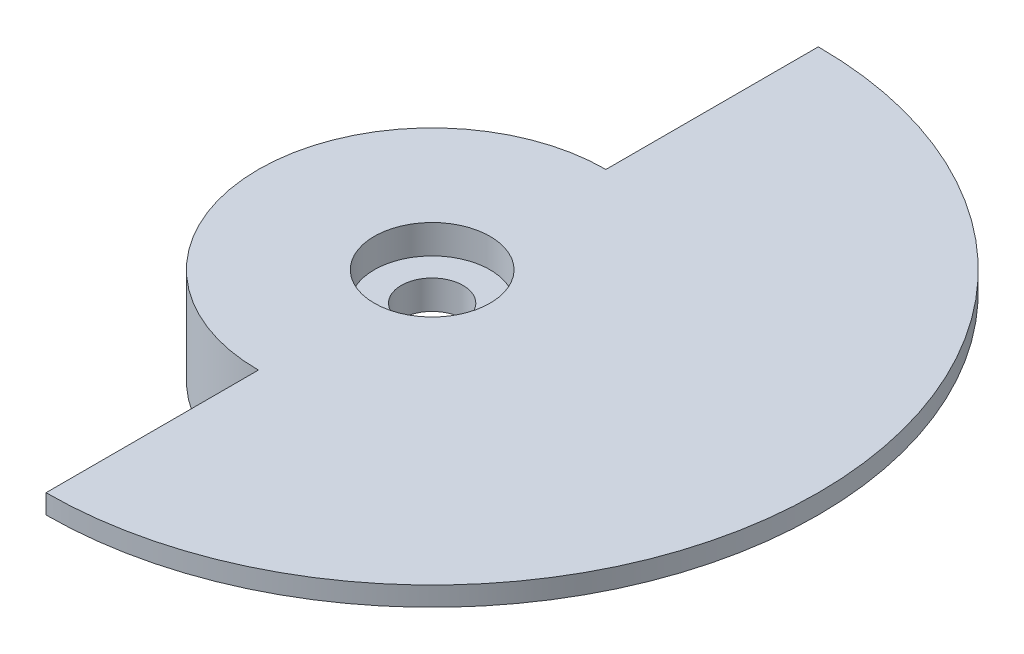
ISO-10303-21;
HEADER;
FILE_DESCRIPTION(('STEP AP214'),'2;1');
FILE_NAME('part.step','',(''),(''),'','','');
FILE_SCHEMA(('AUTOMOTIVE_DESIGN { 1 0 10303 214 1 1 1 1 }'));
ENDSEC;
DATA;
#1=APPLICATION_CONTEXT('core data for automotive mechanical design processes');
#2=APPLICATION_PROTOCOL_DEFINITION('international standard','automotive_design',2000,#1);
#3=PRODUCT_CONTEXT('',#1,'mechanical');
#4=PRODUCT('Part','Part','',(#3));
#5=PRODUCT_RELATED_PRODUCT_CATEGORY('part','',(#4));
#6=PRODUCT_DEFINITION_FORMATION('','',#4);
#7=PRODUCT_DEFINITION_CONTEXT('part definition',#1,'design');
#8=PRODUCT_DEFINITION('design','',#6,#7);
#9=PRODUCT_DEFINITION_SHAPE('','',#8);
#10=(LENGTH_UNIT() NAMED_UNIT(*) SI_UNIT(.MILLI.,.METRE.));
#11=(NAMED_UNIT(*) PLANE_ANGLE_UNIT() SI_UNIT($,.RADIAN.));
#12=(NAMED_UNIT(*) SI_UNIT($,.STERADIAN.) SOLID_ANGLE_UNIT());
#13=UNCERTAINTY_MEASURE_WITH_UNIT(LENGTH_MEASURE(1.E-05),#10,'distance_accuracy_value','');
#14=(GEOMETRIC_REPRESENTATION_CONTEXT(3) GLOBAL_UNCERTAINTY_ASSIGNED_CONTEXT((#13)) GLOBAL_UNIT_ASSIGNED_CONTEXT((#10,
#11,#12)) REPRESENTATION_CONTEXT('',''));
#15=CARTESIAN_POINT('',(0.,0.,0.));
#16=DIRECTION('',(0.,0.,1.));
#17=DIRECTION('',(1.,0.,0.));
#18=AXIS2_PLACEMENT_3D('',#15,#16,#17);
#19=CARTESIAN_POINT('',(0.,3.,0.));
#20=DIRECTION('',(0.,1.,0.));
#21=DIRECTION('',(0.,0.,1.));
#22=AXIS2_PLACEMENT_3D('',#19,#20,#21);
#23=CYLINDRICAL_SURFACE('',#22,1.6);
#24=CARTESIAN_POINT('',(0.,3.,0.));
#25=DIRECTION('',(0.,1.,0.));
#26=DIRECTION('',(0.,0.,1.));
#27=AXIS2_PLACEMENT_3D('',#24,#25,#26);
#28=CIRCLE('',#27,1.6);
#29=CARTESIAN_POINT('',(0.,3.,1.6));
#30=VERTEX_POINT('',#29);
#31=EDGE_CURVE('E255',#30,#30,#28,.T.);
#32=ORIENTED_EDGE('',*,*,#31,.F.);
#33=EDGE_LOOP('',(#32));
#34=FACE_BOUND('',#33,.T.);
#35=CARTESIAN_POINT('',(0.,4.5,0.));
#36=DIRECTION('',(0.,1.,0.));
#37=DIRECTION('',(0.,0.,1.));
#38=AXIS2_PLACEMENT_3D('',#35,#36,#37);
#39=CIRCLE('',#38,1.6);
#40=CARTESIAN_POINT('',(0.,4.5,1.6));
#41=VERTEX_POINT('',#40);
#42=EDGE_CURVE('E253',#41,#41,#39,.F.);
#43=ORIENTED_EDGE('',*,*,#42,.F.);
#44=EDGE_LOOP('',(#43));
#45=FACE_BOUND('',#44,.T.);
#46=ADVANCED_FACE('F43',(#34,#45),#23,.F.);
#47=CARTESIAN_POINT('',(0.,6.,0.));
#48=DIRECTION('',(0.,-1.,0.));
#49=DIRECTION('',(0.,0.,-1.));
#50=AXIS2_PLACEMENT_3D('',#47,#48,#49);
#51=CYLINDRICAL_SURFACE('',#50,7.5);
#52=DIRECTION('',(0.,-1.,0.));
#53=VECTOR('',#52,1.);
#54=CARTESIAN_POINT('',(0.856553191197171,3.,7.45092723294566));
#55=LINE('',#54,#53);
#56=CARTESIAN_POINT('',(0.85655319119717,3.,7.45092723294557));
#57=VERTEX_POINT('',#56);
#58=CARTESIAN_POINT('',(0.856553191197171,0.,7.45092723294557));
#59=VERTEX_POINT('',#58);
#60=EDGE_CURVE('E198',#57,#59,#55,.T.);
#61=ORIENTED_EDGE('',*,*,#60,.F.);
#62=CARTESIAN_POINT('',(0.,3.,0.));
#63=DIRECTION('',(0.,1.,0.));
#64=DIRECTION('',(0.,0.,1.));
#65=AXIS2_PLACEMENT_3D('',#62,#63,#64);
#66=CIRCLE('',#65,7.5);
#67=CARTESIAN_POINT('',(7.44042990767577,3.,0.943399591352425));
#68=VERTEX_POINT('',#67);
#69=EDGE_CURVE('E180',#57,#68,#66,.T.);
#70=ORIENTED_EDGE('',*,*,#69,.T.);
#71=DIRECTION('',(0.,-1.,0.));
#72=VECTOR('',#71,1.);
#73=CARTESIAN_POINT('',(7.44042990767586,3.,0.943399591352425));
#74=LINE('',#73,#72);
#75=CARTESIAN_POINT('',(7.44042990767586,0.,0.943399591352425));
#76=VERTEX_POINT('',#75);
#77=EDGE_CURVE('E584',#68,#76,#74,.T.);
#78=ORIENTED_EDGE('',*,*,#77,.T.);
#79=CARTESIAN_POINT('',(0.,0.,0.));
#80=DIRECTION('',(0.,1.,0.));
#81=DIRECTION('',(0.,0.,1.));
#82=AXIS2_PLACEMENT_3D('',#79,#80,#81);
#83=CIRCLE('',#82,7.5);
#84=EDGE_CURVE('E208',#59,#76,#83,.T.);
#85=ORIENTED_EDGE('',*,*,#84,.F.);
#86=EDGE_LOOP('',(#61,#70,#78,#85));
#87=FACE_BOUND('',#86,.T.);
#88=ADVANCED_FACE('F206',(#87),#51,.F.);
#89=DIRECTION('',(0.,-1.,0.));
#90=VECTOR('',#89,1.);
#91=CARTESIAN_POINT('',(7.45092723294566,3.,-0.85655319119717));
#92=LINE('',#91,#90);
#93=CARTESIAN_POINT('',(7.45092723294557,3.,-0.85655319119717));
#94=VERTEX_POINT('',#93);
#95=CARTESIAN_POINT('',(7.45092723294557,0.,-0.85655319119717));
#96=VERTEX_POINT('',#95);
#97=EDGE_CURVE('E578',#94,#96,#92,.T.);
#98=ORIENTED_EDGE('',*,*,#97,.F.);
#99=CARTESIAN_POINT('',(0.943399591352426,3.,-7.44042990767577));
#100=VERTEX_POINT('',#99);
#101=EDGE_CURVE('E192',#94,#100,#66,.T.);
#102=ORIENTED_EDGE('',*,*,#101,.T.);
#103=DIRECTION('',(0.,-1.,0.));
#104=VECTOR('',#103,1.);
#105=CARTESIAN_POINT('',(0.943399591352429,3.,-7.44042990767586));
#106=LINE('',#105,#104);
#107=CARTESIAN_POINT('',(0.943399591352429,0.,-7.44042990767586));
#108=VERTEX_POINT('',#107);
#109=EDGE_CURVE('E659',#100,#108,#106,.T.);
#110=ORIENTED_EDGE('',*,*,#109,.T.);
#111=EDGE_CURVE('E250',#96,#108,#83,.T.);
#112=ORIENTED_EDGE('',*,*,#111,.F.);
#113=EDGE_LOOP('',(#98,#102,#110,#112));
#114=FACE_BOUND('',#113,.T.);
#115=ADVANCED_FACE('F282',(#114),#51,.F.);
#116=DIRECTION('',(0.,-1.,0.));
#117=VECTOR('',#116,1.);
#118=CARTESIAN_POINT('',(-0.85655319119717,3.,-7.45092723294566));
#119=LINE('',#118,#117);
#120=CARTESIAN_POINT('',(-0.856553191196794,3.,-7.45092723294561));
#121=VERTEX_POINT('',#120);
#122=CARTESIAN_POINT('',(-0.85655319119717,0.,-7.45092723294557));
#123=VERTEX_POINT('',#122);
#124=EDGE_CURVE('E656',#121,#123,#119,.T.);
#125=ORIENTED_EDGE('',*,*,#124,.F.);
#126=CARTESIAN_POINT('',(-7.44042990767577,3.,-0.943399591352426));
#127=VERTEX_POINT('',#126);
#128=EDGE_CURVE('E627',#121,#127,#66,.T.);
#129=ORIENTED_EDGE('',*,*,#128,.T.);
#130=DIRECTION('',(0.,-1.,0.));
#131=VECTOR('',#130,1.);
#132=CARTESIAN_POINT('',(-7.44042990767582,3.,-0.943399591352415));
#133=LINE('',#132,#131);
#134=CARTESIAN_POINT('',(-7.44042990767582,0.,-0.943399591352415));
#135=VERTEX_POINT('',#134);
#136=EDGE_CURVE('E635',#127,#135,#133,.T.);
#137=ORIENTED_EDGE('',*,*,#136,.T.);
#138=EDGE_CURVE('E680',#123,#135,#83,.T.);
#139=ORIENTED_EDGE('',*,*,#138,.F.);
#140=EDGE_LOOP('',(#125,#129,#137,#139));
#141=FACE_BOUND('',#140,.T.);
#142=ADVANCED_FACE('F477',(#141),#51,.F.);
#143=DIRECTION('',(0.,-1.,0.));
#144=VECTOR('',#143,1.);
#145=CARTESIAN_POINT('',(-7.45092723294559,3.,0.856553191197039));
#146=LINE('',#145,#144);
#147=CARTESIAN_POINT('',(-7.45092723294559,3.,0.856553191197039));
#148=VERTEX_POINT('',#147);
#149=CARTESIAN_POINT('',(-7.45092723294559,0.,0.856553191197038));
#150=VERTEX_POINT('',#149);
#151=EDGE_CURVE('E626',#148,#150,#146,.T.);
#152=ORIENTED_EDGE('',*,*,#151,.F.);
#153=CARTESIAN_POINT('',(-0.943399591352425,3.,7.44042990767577));
#154=VERTEX_POINT('',#153);
#155=EDGE_CURVE('E194',#148,#154,#66,.T.);
#156=ORIENTED_EDGE('',*,*,#155,.T.);
#157=DIRECTION('',(0.,-1.,0.));
#158=VECTOR('',#157,1.);
#159=CARTESIAN_POINT('',(-0.943399591352425,3.,7.44042990767586));
#160=LINE('',#159,#158);
#161=CARTESIAN_POINT('',(-0.943399591352425,0.,7.44042990767586));
#162=VERTEX_POINT('',#161);
#163=EDGE_CURVE('E209',#154,#162,#160,.T.);
#164=ORIENTED_EDGE('',*,*,#163,.T.);
#165=EDGE_CURVE('E241',#150,#162,#83,.T.);
#166=ORIENTED_EDGE('',*,*,#165,.F.);
#167=EDGE_LOOP('',(#152,#156,#164,#166));
#168=FACE_BOUND('',#167,.T.);
#169=ADVANCED_FACE('F284',(#168),#51,.F.);
#170=CARTESIAN_POINT('',(0.,6.,0.));
#171=DIRECTION('',(0.,1.,0.));
#172=DIRECTION('',(0.,0.,1.));
#173=AXIS2_PLACEMENT_3D('',#170,#171,#172);
#174=PLANE('',#173);
#175=CARTESIAN_POINT('',(0.,6.,0.));
#176=DIRECTION('',(0.,1.,0.));
#177=DIRECTION('',(0.,0.,1.));
#178=AXIS2_PLACEMENT_3D('',#175,#176,#177);
#179=CIRCLE('',#178,3.);
#180=CARTESIAN_POINT('',(0.,6.,3.));
#181=VERTEX_POINT('',#180);
#182=EDGE_CURVE('E688',#181,#181,#179,.T.);
#183=ORIENTED_EDGE('',*,*,#182,.F.);
#184=EDGE_LOOP('',(#183));
#185=FACE_BOUND('',#184,.T.);
#186=CARTESIAN_POINT('',(0.,6.,0.));
#187=DIRECTION('',(0.,1.,0.));
#188=DIRECTION('',(0.,0.,1.));
#189=AXIS2_PLACEMENT_3D('',#186,#187,#188);
#190=CIRCLE('',#189,9.);
#191=CARTESIAN_POINT('',(0.,6.,-9.));
#192=VERTEX_POINT('',#191);
#193=CARTESIAN_POINT('',(0.,6.,9.));
#194=VERTEX_POINT('',#193);
#195=EDGE_CURVE('E249',#192,#194,#190,.T.);
#196=ORIENTED_EDGE('',*,*,#195,.T.);
#197=DIRECTION('',(0.,0.,1.));
#198=VECTOR('',#197,1.);
#199=CARTESIAN_POINT('',(0.,6.,0.));
#200=LINE('',#199,#198);
#201=CARTESIAN_POINT('',(0.,6.,20.));
#202=VERTEX_POINT('',#201);
#203=EDGE_CURVE('E230',#194,#202,#200,.T.);
#204=ORIENTED_EDGE('',*,*,#203,.T.);
#205=CARTESIAN_POINT('',(0.,6.,0.));
#206=DIRECTION('',(0.,1.,0.));
#207=DIRECTION('',(0.,0.,1.));
#208=AXIS2_PLACEMENT_3D('',#205,#206,#207);
#209=CIRCLE('',#208,20.);
#210=CARTESIAN_POINT('',(0.,6.,-20.));
#211=VERTEX_POINT('',#210);
#212=EDGE_CURVE('E233',#202,#211,#209,.T.);
#213=ORIENTED_EDGE('',*,*,#212,.T.);
#214=DIRECTION('',(0.,0.,-1.));
#215=VECTOR('',#214,1.);
#216=CARTESIAN_POINT('',(0.,6.,0.));
#217=LINE('',#216,#215);
#218=EDGE_CURVE('E222',#192,#211,#217,.T.);
#219=ORIENTED_EDGE('',*,*,#218,.F.);
#220=EDGE_LOOP('',(#196,#204,#213,#219));
#221=FACE_BOUND('',#220,.T.);
#222=ADVANCED_FACE('F353',(#185,#221),#174,.T.);
#223=CARTESIAN_POINT('',(0.,0.,0.));
#224=DIRECTION('',(0.,1.,0.));
#225=DIRECTION('',(0.,0.,1.));
#226=AXIS2_PLACEMENT_3D('',#223,#224,#225);
#227=PLANE('',#226);
#228=CARTESIAN_POINT('',(0.,0.,0.));
#229=DIRECTION('',(0.,1.,0.));
#230=DIRECTION('',(0.,0.,1.));
#231=AXIS2_PLACEMENT_3D('',#228,#229,#230);
#232=CIRCLE('',#231,7.99999999999999);
#233=CARTESIAN_POINT('',(0.,0.,7.99999999999999));
#234=VERTEX_POINT('',#233);
#235=EDGE_CURVE('E11',#234,#234,#232,.F.);
#236=ORIENTED_EDGE('',*,*,#235,.T.);
#237=EDGE_LOOP('',(#236));
#238=FACE_BOUND('',#237,.T.);
#239=ORIENTED_EDGE('',*,*,#84,.T.);
#240=DIRECTION('',(-1.,0.,0.));
#241=VECTOR('',#240,1.);
#242=CARTESIAN_POINT('',(6.3123397412791,0.,0.943399591352425));
#243=LINE('',#242,#241);
#244=CARTESIAN_POINT('',(5.41848661630136,0.,0.943399591352425));
#245=VERTEX_POINT('',#244);
#246=EDGE_CURVE('E601',#76,#245,#243,.T.);
#247=ORIENTED_EDGE('',*,*,#246,.T.);
#248=CARTESIAN_POINT('',(0.,0.,0.));
#249=DIRECTION('',(0.,1.,0.));
#250=DIRECTION('',(0.,0.,-1.));
#251=AXIS2_PLACEMENT_3D('',#248,#249,#250);
#252=CIRCLE('',#251,5.50000000000008);
#253=CARTESIAN_POINT('',(5.43289210555951,0.,-0.85655319119717));
#254=VERTEX_POINT('',#253);
#255=EDGE_CURVE('E598',#245,#254,#252,.T.);
#256=ORIENTED_EDGE('',*,*,#255,.T.);
#257=DIRECTION('',(1.,0.,0.));
#258=VECTOR('',#257,1.);
#259=CARTESIAN_POINT('',(6.32608265113426,0.,-0.85655319119717));
#260=LINE('',#259,#258);
#261=EDGE_CURVE('E605',#254,#96,#260,.T.);
#262=ORIENTED_EDGE('',*,*,#261,.T.);
#263=ORIENTED_EDGE('',*,*,#111,.T.);
#264=DIRECTION('',(0.,0.,1.));
#265=VECTOR('',#264,1.);
#266=CARTESIAN_POINT('',(0.943399591352426,0.,-6.3123397412791));
#267=LINE('',#266,#265);
#268=CARTESIAN_POINT('',(0.943399591352426,0.,-5.41848661630136));
#269=VERTEX_POINT('',#268);
#270=EDGE_CURVE('E667',#108,#269,#267,.T.);
#271=ORIENTED_EDGE('',*,*,#270,.T.);
#272=CARTESIAN_POINT('',(0.,0.,0.));
#273=DIRECTION('',(0.,1.,0.));
#274=DIRECTION('',(0.,0.,-1.));
#275=AXIS2_PLACEMENT_3D('',#272,#273,#274);
#276=CIRCLE('',#275,5.50000000000008);
#277=CARTESIAN_POINT('',(-0.856553191197174,0.,-5.43289210555951));
#278=VERTEX_POINT('',#277);
#279=EDGE_CURVE('E665',#269,#278,#276,.T.);
#280=ORIENTED_EDGE('',*,*,#279,.T.);
#281=DIRECTION('',(-1.47471868623086E-13,0.,-1.));
#282=VECTOR('',#281,1.);
#283=CARTESIAN_POINT('',(-0.856553191197004,0.,-6.32608265113425));
#284=LINE('',#283,#282);
#285=EDGE_CURVE('E66',#278,#123,#284,.T.);
#286=ORIENTED_EDGE('',*,*,#285,.T.);
#287=ORIENTED_EDGE('',*,*,#138,.T.);
#288=DIRECTION('',(1.,0.,0.));
#289=VECTOR('',#288,1.);
#290=CARTESIAN_POINT('',(-6.3123397412791,0.,-0.943399591352426));
#291=LINE('',#290,#289);
#292=CARTESIAN_POINT('',(-5.41848661630136,0.,-0.943399591352426));
#293=VERTEX_POINT('',#292);
#294=EDGE_CURVE('E644',#135,#293,#291,.T.);
#295=ORIENTED_EDGE('',*,*,#294,.T.);
#296=CARTESIAN_POINT('',(0.,0.,0.));
#297=DIRECTION('',(0.,1.,0.));
#298=DIRECTION('',(0.,0.,-1.));
#299=AXIS2_PLACEMENT_3D('',#296,#297,#298);
#300=CIRCLE('',#299,5.50000000000004);
#301=CARTESIAN_POINT('',(-5.43289210555949,0.,0.856553191197022));
#302=VERTEX_POINT('',#301);
#303=EDGE_CURVE('E642',#293,#302,#300,.T.);
#304=ORIENTED_EDGE('',*,*,#303,.T.);
#305=DIRECTION('',(-1.,0.,0.));
#306=VECTOR('',#305,1.);
#307=CARTESIAN_POINT('',(-6.32608265113425,0.,0.856553191197027));
#308=LINE('',#307,#306);
#309=EDGE_CURVE('E59',#302,#150,#308,.T.);
#310=ORIENTED_EDGE('',*,*,#309,.T.);
#311=ORIENTED_EDGE('',*,*,#165,.T.);
#312=DIRECTION('',(0.,0.,-1.));
#313=VECTOR('',#312,1.);
#314=CARTESIAN_POINT('',(-0.943399591352425,0.,6.3123397412791));
#315=LINE('',#314,#313);
#316=CARTESIAN_POINT('',(-0.943399591352425,0.,5.41848661630136));
#317=VERTEX_POINT('',#316);
#318=EDGE_CURVE('E613',#162,#317,#315,.T.);
#319=ORIENTED_EDGE('',*,*,#318,.T.);
#320=CARTESIAN_POINT('',(0.,0.,0.));
#321=DIRECTION('',(0.,1.,0.));
#322=DIRECTION('',(0.,0.,-1.));
#323=AXIS2_PLACEMENT_3D('',#320,#321,#322);
#324=CIRCLE('',#323,5.50000000000008);
#325=CARTESIAN_POINT('',(0.856553191197171,0.,5.43289210555951));
#326=VERTEX_POINT('',#325);
#327=EDGE_CURVE('E204',#317,#326,#324,.T.);
#328=ORIENTED_EDGE('',*,*,#327,.T.);
#329=DIRECTION('',(0.,0.,1.));
#330=VECTOR('',#329,1.);
#331=CARTESIAN_POINT('',(0.856553191197171,0.,6.32608265113426));
#332=LINE('',#331,#330);
#333=EDGE_CURVE('E606',#326,#59,#332,.T.);
#334=ORIENTED_EDGE('',*,*,#333,.T.);
#335=EDGE_LOOP('',(#239,#247,#256,#262,#263,#271,#280,#286,#287,#295,#304,#310,#311,#319,#328,#334));
#336=FACE_BOUND('',#335,.T.);
#337=ADVANCED_FACE('F355',(#238,#336),#227,.F.);
#338=CARTESIAN_POINT('',(0.,6.,0.));
#339=DIRECTION('',(0.,-1.,0.));
#340=DIRECTION('',(0.,0.,-1.));
#341=AXIS2_PLACEMENT_3D('',#338,#339,#340);
#342=CYLINDRICAL_SURFACE('',#341,9.);
#343=CARTESIAN_POINT('',(0.,0.999999999999999,0.));
#344=DIRECTION('',(0.,1.,0.));
#345=DIRECTION('',(0.,0.,1.));
#346=AXIS2_PLACEMENT_3D('',#343,#344,#345);
#347=CIRCLE('',#346,9.);
#348=CARTESIAN_POINT('',(0.,0.999999999999999,9.));
#349=VERTEX_POINT('',#348);
#350=EDGE_CURVE('E52',#349,#349,#347,.T.);
#351=ORIENTED_EDGE('',*,*,#350,.T.);
#352=EDGE_LOOP('',(#351));
#353=FACE_BOUND('',#352,.T.);
#354=CARTESIAN_POINT('',(0.,5.,0.));
#355=DIRECTION('',(0.,1.,0.));
#356=DIRECTION('',(0.,0.,1.));
#357=AXIS2_PLACEMENT_3D('',#354,#355,#356);
#358=CIRCLE('',#357,9.);
#359=CARTESIAN_POINT('',(0.,5.,9.));
#360=VERTEX_POINT('',#359);
#361=CARTESIAN_POINT('',(0.,5.,-9.));
#362=VERTEX_POINT('',#361);
#363=EDGE_CURVE('E227',#360,#362,#358,.T.);
#364=ORIENTED_EDGE('',*,*,#363,.F.);
#365=DIRECTION('',(0.,1.,0.));
#366=VECTOR('',#365,1.);
#367=CARTESIAN_POINT('',(0.,5.,9.));
#368=LINE('',#367,#366);
#369=EDGE_CURVE('E238',#360,#194,#368,.T.);
#370=ORIENTED_EDGE('',*,*,#369,.T.);
#371=ORIENTED_EDGE('',*,*,#195,.F.);
#372=DIRECTION('',(0.,1.,0.));
#373=VECTOR('',#372,1.);
#374=CARTESIAN_POINT('',(0.,5.,-9.));
#375=LINE('',#374,#373);
#376=EDGE_CURVE('E242',#362,#192,#375,.T.);
#377=ORIENTED_EDGE('',*,*,#376,.F.);
#378=EDGE_LOOP('',(#364,#370,#371,#377));
#379=FACE_BOUND('',#378,.T.);
#380=ADVANCED_FACE('F260',(#353,#379),#342,.T.);
#381=CARTESIAN_POINT('',(0.,5.,0.));
#382=DIRECTION('',(-1.,0.,0.));
#383=DIRECTION('',(0.,0.,1.));
#384=AXIS2_PLACEMENT_3D('',#381,#382,#383);
#385=PLANE('',#384);
#386=ORIENTED_EDGE('',*,*,#203,.F.);
#387=ORIENTED_EDGE('',*,*,#369,.F.);
#388=DIRECTION('',(0.,0.,1.));
#389=VECTOR('',#388,1.);
#390=CARTESIAN_POINT('',(0.,5.,0.));
#391=LINE('',#390,#389);
#392=CARTESIAN_POINT('',(0.,5.,20.));
#393=VERTEX_POINT('',#392);
#394=EDGE_CURVE('E218',#360,#393,#391,.T.);
#395=ORIENTED_EDGE('',*,*,#394,.T.);
#396=DIRECTION('',(0.,1.,0.));
#397=VECTOR('',#396,1.);
#398=CARTESIAN_POINT('',(0.,5.,20.));
#399=LINE('',#398,#397);
#400=EDGE_CURVE('E229',#393,#202,#399,.T.);
#401=ORIENTED_EDGE('',*,*,#400,.T.);
#402=EDGE_LOOP('',(#386,#387,#395,#401));
#403=FACE_BOUND('',#402,.T.);
#404=ADVANCED_FACE('F345',(#403),#385,.T.);
#405=CARTESIAN_POINT('',(0.,5.,0.));
#406=DIRECTION('',(1.,0.,0.));
#407=DIRECTION('',(0.,0.,-1.));
#408=AXIS2_PLACEMENT_3D('',#405,#406,#407);
#409=PLANE('',#408);
#410=ORIENTED_EDGE('',*,*,#218,.T.);
#411=DIRECTION('',(0.,1.,0.));
#412=VECTOR('',#411,1.);
#413=CARTESIAN_POINT('',(0.,5.,-20.));
#414=LINE('',#413,#412);
#415=CARTESIAN_POINT('',(0.,5.,-20.));
#416=VERTEX_POINT('',#415);
#417=EDGE_CURVE('E245',#416,#211,#414,.T.);
#418=ORIENTED_EDGE('',*,*,#417,.F.);
#419=DIRECTION('',(0.,0.,-1.));
#420=VECTOR('',#419,1.);
#421=CARTESIAN_POINT('',(0.,5.,0.));
#422=LINE('',#421,#420);
#423=EDGE_CURVE('E225',#362,#416,#422,.T.);
#424=ORIENTED_EDGE('',*,*,#423,.F.);
#425=ORIENTED_EDGE('',*,*,#376,.T.);
#426=EDGE_LOOP('',(#410,#418,#424,#425));
#427=FACE_BOUND('',#426,.T.);
#428=ADVANCED_FACE('F342',(#427),#409,.F.);
#429=CARTESIAN_POINT('',(0.,5.,0.));
#430=DIRECTION('',(0.,1.,0.));
#431=DIRECTION('',(0.,0.,1.));
#432=AXIS2_PLACEMENT_3D('',#429,#430,#431);
#433=CYLINDRICAL_SURFACE('',#432,20.);
#434=ORIENTED_EDGE('',*,*,#212,.F.);
#435=ORIENTED_EDGE('',*,*,#400,.F.);
#436=CARTESIAN_POINT('',(0.,5.,0.));
#437=DIRECTION('',(0.,1.,0.));
#438=DIRECTION('',(0.,0.,1.));
#439=AXIS2_PLACEMENT_3D('',#436,#437,#438);
#440=CIRCLE('',#439,20.);
#441=EDGE_CURVE('E221',#393,#416,#440,.T.);
#442=ORIENTED_EDGE('',*,*,#441,.T.);
#443=ORIENTED_EDGE('',*,*,#417,.T.);
#444=EDGE_LOOP('',(#434,#435,#442,#443));
#445=FACE_BOUND('',#444,.T.);
#446=ADVANCED_FACE('F340',(#445),#433,.T.);
#447=CARTESIAN_POINT('',(0.,5.,0.));
#448=DIRECTION('',(0.,1.,0.));
#449=DIRECTION('',(0.,0.,1.));
#450=AXIS2_PLACEMENT_3D('',#447,#448,#449);
#451=PLANE('',#450);
#452=ORIENTED_EDGE('',*,*,#394,.F.);
#453=ORIENTED_EDGE('',*,*,#363,.T.);
#454=ORIENTED_EDGE('',*,*,#423,.T.);
#455=ORIENTED_EDGE('',*,*,#441,.F.);
#456=EDGE_LOOP('',(#452,#453,#454,#455));
#457=FACE_BOUND('',#456,.T.);
#458=ADVANCED_FACE('F331',(#457),#451,.F.);
#459=CARTESIAN_POINT('',(0.,3.,0.));
#460=DIRECTION('',(0.,-1.,0.));
#461=DIRECTION('',(0.,0.,-1.));
#462=AXIS2_PLACEMENT_3D('',#459,#460,#461);
#463=CYLINDRICAL_SURFACE('',#462,5.50000000000008);
#464=ORIENTED_EDGE('',*,*,#327,.F.);
#465=DIRECTION('',(0.,-1.,0.));
#466=VECTOR('',#465,1.);
#467=CARTESIAN_POINT('',(-0.943399591352425,3.,5.41848661630136));
#468=LINE('',#467,#466);
#469=CARTESIAN_POINT('',(-0.943399591352425,3.,5.41848661630136));
#470=VERTEX_POINT('',#469);
#471=EDGE_CURVE('E213',#470,#317,#468,.T.);
#472=ORIENTED_EDGE('',*,*,#471,.F.);
#473=CARTESIAN_POINT('',(0.,3.,0.));
#474=DIRECTION('',(0.,1.,0.));
#475=DIRECTION('',(0.,0.,-1.));
#476=AXIS2_PLACEMENT_3D('',#473,#474,#475);
#477=CIRCLE('',#476,5.50000000000008);
#478=CARTESIAN_POINT('',(0.856553191197171,3.,5.43289210555951));
#479=VERTEX_POINT('',#478);
#480=EDGE_CURVE('E210',#470,#479,#477,.T.);
#481=ORIENTED_EDGE('',*,*,#480,.T.);
#482=DIRECTION('',(0.,-1.,0.));
#483=VECTOR('',#482,1.);
#484=CARTESIAN_POINT('',(0.856553191197171,3.,5.43289210555951));
#485=LINE('',#484,#483);
#486=EDGE_CURVE('E201',#479,#326,#485,.T.);
#487=ORIENTED_EDGE('',*,*,#486,.T.);
#488=EDGE_LOOP('',(#464,#472,#481,#487));
#489=FACE_BOUND('',#488,.T.);
#490=ADVANCED_FACE('F327',(#489),#463,.F.);
#491=CARTESIAN_POINT('',(-0.943399591352425,3.,6.3123397412791));
#492=DIRECTION('',(-1.,0.,0.));
#493=DIRECTION('',(0.,0.,1.));
#494=AXIS2_PLACEMENT_3D('',#491,#492,#493);
#495=PLANE('',#494);
#496=ORIENTED_EDGE('',*,*,#318,.F.);
#497=ORIENTED_EDGE('',*,*,#163,.F.);
#498=DIRECTION('',(0.,0.,-1.));
#499=VECTOR('',#498,1.);
#500=CARTESIAN_POINT('',(-0.943399591352425,3.,6.3123397412791));
#501=LINE('',#500,#499);
#502=EDGE_CURVE('E203',#154,#470,#501,.T.);
#503=ORIENTED_EDGE('',*,*,#502,.T.);
#504=ORIENTED_EDGE('',*,*,#471,.T.);
#505=EDGE_LOOP('',(#496,#497,#503,#504));
#506=FACE_BOUND('',#505,.T.);
#507=ADVANCED_FACE('F330',(#506),#495,.T.);
#508=CARTESIAN_POINT('',(0.856553191197171,3.,6.32608265113426));
#509=DIRECTION('',(1.,0.,0.));
#510=DIRECTION('',(0.,0.,-1.));
#511=AXIS2_PLACEMENT_3D('',#508,#509,#510);
#512=PLANE('',#511);
#513=ORIENTED_EDGE('',*,*,#333,.F.);
#514=ORIENTED_EDGE('',*,*,#486,.F.);
#515=DIRECTION('',(0.,0.,1.));
#516=VECTOR('',#515,1.);
#517=CARTESIAN_POINT('',(0.856553191197171,3.,6.32608265113426));
#518=LINE('',#517,#516);
#519=EDGE_CURVE('E183',#479,#57,#518,.T.);
#520=ORIENTED_EDGE('',*,*,#519,.T.);
#521=ORIENTED_EDGE('',*,*,#60,.T.);
#522=EDGE_LOOP('',(#513,#514,#520,#521));
#523=FACE_BOUND('',#522,.T.);
#524=ADVANCED_FACE('F197',(#523),#512,.T.);
#525=CARTESIAN_POINT('',(0.,3.,0.));
#526=DIRECTION('',(0.,-1.,0.));
#527=DIRECTION('',(0.,0.,-1.));
#528=AXIS2_PLACEMENT_3D('',#525,#526,#527);
#529=CYLINDRICAL_SURFACE('',#528,5.50000000000008);
#530=ORIENTED_EDGE('',*,*,#255,.F.);
#531=DIRECTION('',(0.,-1.,0.));
#532=VECTOR('',#531,1.);
#533=CARTESIAN_POINT('',(5.41848661630136,3.,0.943399591352425));
#534=LINE('',#533,#532);
#535=CARTESIAN_POINT('',(5.41848661630136,3.,0.943399591352425));
#536=VERTEX_POINT('',#535);
#537=EDGE_CURVE('E588',#536,#245,#534,.T.);
#538=ORIENTED_EDGE('',*,*,#537,.F.);
#539=CARTESIAN_POINT('',(0.,3.,0.));
#540=DIRECTION('',(0.,1.,0.));
#541=DIRECTION('',(0.,0.,-1.));
#542=AXIS2_PLACEMENT_3D('',#539,#540,#541);
#543=CIRCLE('',#542,5.50000000000008);
#544=CARTESIAN_POINT('',(5.43289210555951,3.,-0.85655319119717));
#545=VERTEX_POINT('',#544);
#546=EDGE_CURVE('E583',#536,#545,#543,.T.);
#547=ORIENTED_EDGE('',*,*,#546,.T.);
#548=DIRECTION('',(0.,-1.,0.));
#549=VECTOR('',#548,1.);
#550=CARTESIAN_POINT('',(5.43289210555951,3.,-0.85655319119717));
#551=LINE('',#550,#549);
#552=EDGE_CURVE('E595',#545,#254,#551,.T.);
#553=ORIENTED_EDGE('',*,*,#552,.T.);
#554=EDGE_LOOP('',(#530,#538,#547,#553));
#555=FACE_BOUND('',#554,.T.);
#556=ADVANCED_FACE('F322',(#555),#529,.F.);
#557=CARTESIAN_POINT('',(6.3123397412791,3.,0.943399591352425));
#558=DIRECTION('',(0.,0.,1.));
#559=DIRECTION('',(1.,0.,0.));
#560=AXIS2_PLACEMENT_3D('',#557,#558,#559);
#561=PLANE('',#560);
#562=ORIENTED_EDGE('',*,*,#246,.F.);
#563=ORIENTED_EDGE('',*,*,#77,.F.);
#564=DIRECTION('',(-1.,0.,0.));
#565=VECTOR('',#564,1.);
#566=CARTESIAN_POINT('',(6.3123397412791,3.,0.943399591352425));
#567=LINE('',#566,#565);
#568=EDGE_CURVE('E186',#68,#536,#567,.T.);
#569=ORIENTED_EDGE('',*,*,#568,.T.);
#570=ORIENTED_EDGE('',*,*,#537,.T.);
#571=EDGE_LOOP('',(#562,#563,#569,#570));
#572=FACE_BOUND('',#571,.T.);
#573=ADVANCED_FACE('F318',(#572),#561,.T.);
#574=CARTESIAN_POINT('',(6.32608265113426,3.,-0.85655319119717));
#575=DIRECTION('',(0.,0.,-1.));
#576=DIRECTION('',(-1.,0.,0.));
#577=AXIS2_PLACEMENT_3D('',#574,#575,#576);
#578=PLANE('',#577);
#579=ORIENTED_EDGE('',*,*,#261,.F.);
#580=ORIENTED_EDGE('',*,*,#552,.F.);
#581=DIRECTION('',(1.,0.,0.));
#582=VECTOR('',#581,1.);
#583=CARTESIAN_POINT('',(6.32608265113426,3.,-0.85655319119717));
#584=LINE('',#583,#582);
#585=EDGE_CURVE('E602',#545,#94,#584,.T.);
#586=ORIENTED_EDGE('',*,*,#585,.T.);
#587=ORIENTED_EDGE('',*,*,#97,.T.);
#588=EDGE_LOOP('',(#579,#580,#586,#587));
#589=FACE_BOUND('',#588,.T.);
#590=ADVANCED_FACE('F314',(#589),#578,.T.);
#591=CARTESIAN_POINT('',(0.,3.,0.));
#592=DIRECTION('',(0.,-1.,0.));
#593=DIRECTION('',(0.,0.,-1.));
#594=AXIS2_PLACEMENT_3D('',#591,#592,#593);
#595=CYLINDRICAL_SURFACE('',#594,5.50000000000008);
#596=ORIENTED_EDGE('',*,*,#279,.F.);
#597=DIRECTION('',(0.,-1.,0.));
#598=VECTOR('',#597,1.);
#599=CARTESIAN_POINT('',(0.943399591352426,3.,-5.41848661630136));
#600=LINE('',#599,#598);
#601=CARTESIAN_POINT('',(0.943399591352426,3.,-5.41848661630136));
#602=VERTEX_POINT('',#601);
#603=EDGE_CURVE('E661',#602,#269,#600,.T.);
#604=ORIENTED_EDGE('',*,*,#603,.F.);
#605=CARTESIAN_POINT('',(0.,3.,0.));
#606=DIRECTION('',(0.,1.,0.));
#607=DIRECTION('',(0.,0.,-1.));
#608=AXIS2_PLACEMENT_3D('',#605,#606,#607);
#609=CIRCLE('',#608,5.50000000000008);
#610=CARTESIAN_POINT('',(-0.856553191196872,3.,-5.43289210555951));
#611=VERTEX_POINT('',#610);
#612=EDGE_CURVE('E658',#602,#611,#609,.T.);
#613=ORIENTED_EDGE('',*,*,#612,.T.);
#614=DIRECTION('',(0.,-1.,0.));
#615=VECTOR('',#614,1.);
#616=CARTESIAN_POINT('',(-0.856553191197174,3.,-5.43289210555951));
#617=LINE('',#616,#615);
#618=EDGE_CURVE('E649',#611,#278,#617,.T.);
#619=ORIENTED_EDGE('',*,*,#618,.T.);
#620=EDGE_LOOP('',(#596,#604,#613,#619));
#621=FACE_BOUND('',#620,.T.);
#622=ADVANCED_FACE('F310',(#621),#595,.F.);
#623=CARTESIAN_POINT('',(0.943399591352426,3.,-6.3123397412791));
#624=DIRECTION('',(1.,0.,0.));
#625=DIRECTION('',(0.,0.,-1.));
#626=AXIS2_PLACEMENT_3D('',#623,#624,#625);
#627=PLANE('',#626);
#628=ORIENTED_EDGE('',*,*,#270,.F.);
#629=ORIENTED_EDGE('',*,*,#109,.F.);
#630=DIRECTION('',(0.,0.,1.));
#631=VECTOR('',#630,1.);
#632=CARTESIAN_POINT('',(0.943399591352426,3.,-6.3123397412791));
#633=LINE('',#632,#631);
#634=EDGE_CURVE('E672',#100,#602,#633,.T.);
#635=ORIENTED_EDGE('',*,*,#634,.T.);
#636=ORIENTED_EDGE('',*,*,#603,.T.);
#637=EDGE_LOOP('',(#628,#629,#635,#636));
#638=FACE_BOUND('',#637,.T.);
#639=ADVANCED_FACE('F306',(#638),#627,.T.);
#640=CARTESIAN_POINT('',(-0.856553191197004,3.,-6.32608265113425));
#641=DIRECTION('',(-1.,0.,1.47471868623086E-13));
#642=DIRECTION('',(1.47471868623086E-13,0.,1.));
#643=AXIS2_PLACEMENT_3D('',#640,#641,#642);
#644=PLANE('',#643);
#645=ORIENTED_EDGE('',*,*,#285,.F.);
#646=ORIENTED_EDGE('',*,*,#618,.F.);
#647=DIRECTION('',(1.86205075818683E-13,0.,-1.));
#648=VECTOR('',#647,1.);
#649=CARTESIAN_POINT('',(-0.856553191197004,3.,-6.32608265113425));
#650=LINE('',#649,#648);
#651=EDGE_CURVE('E591',#611,#121,#650,.T.);
#652=ORIENTED_EDGE('',*,*,#651,.T.);
#653=ORIENTED_EDGE('',*,*,#124,.T.);
#654=EDGE_LOOP('',(#645,#646,#652,#653));
#655=FACE_BOUND('',#654,.T.);
#656=ADVANCED_FACE('F302',(#655),#644,.T.);
#657=CARTESIAN_POINT('',(0.,3.,0.));
#658=DIRECTION('',(0.,-1.,0.));
#659=DIRECTION('',(0.,0.,-1.));
#660=AXIS2_PLACEMENT_3D('',#657,#658,#659);
#661=CYLINDRICAL_SURFACE('',#660,5.50000000000004);
#662=ORIENTED_EDGE('',*,*,#303,.F.);
#663=DIRECTION('',(0.,-1.,0.));
#664=VECTOR('',#663,1.);
#665=CARTESIAN_POINT('',(-5.41848661630136,3.,-0.943399591352426));
#666=LINE('',#665,#664);
#667=CARTESIAN_POINT('',(-5.41848661630132,3.,-0.943399591352419));
#668=VERTEX_POINT('',#667);
#669=EDGE_CURVE('E638',#668,#293,#666,.T.);
#670=ORIENTED_EDGE('',*,*,#669,.F.);
#671=CARTESIAN_POINT('',(0.,3.,0.));
#672=DIRECTION('',(0.,1.,0.));
#673=DIRECTION('',(0.,0.,-1.));
#674=AXIS2_PLACEMENT_3D('',#671,#672,#673);
#675=CIRCLE('',#674,5.50000000000004);
#676=CARTESIAN_POINT('',(-5.43289210555949,3.,0.856553191197017));
#677=VERTEX_POINT('',#676);
#678=EDGE_CURVE('E634',#668,#677,#675,.T.);
#679=ORIENTED_EDGE('',*,*,#678,.T.);
#680=DIRECTION('',(0.,-1.,0.));
#681=VECTOR('',#680,1.);
#682=CARTESIAN_POINT('',(-5.43289210555949,3.,0.856553191197022));
#683=LINE('',#682,#681);
#684=EDGE_CURVE('E191',#677,#302,#683,.T.);
#685=ORIENTED_EDGE('',*,*,#684,.T.);
#686=EDGE_LOOP('',(#662,#670,#679,#685));
#687=FACE_BOUND('',#686,.T.);
#688=ADVANCED_FACE('F298',(#687),#661,.F.);
#689=CARTESIAN_POINT('',(-6.3123397412791,3.,-0.943399591352426));
#690=DIRECTION('',(0.,0.,-1.));
#691=DIRECTION('',(-1.,0.,0.));
#692=AXIS2_PLACEMENT_3D('',#689,#690,#691);
#693=PLANE('',#692);
#694=ORIENTED_EDGE('',*,*,#294,.F.);
#695=ORIENTED_EDGE('',*,*,#136,.F.);
#696=DIRECTION('',(1.,0.,0.));
#697=VECTOR('',#696,1.);
#698=CARTESIAN_POINT('',(-6.3123397412791,3.,-0.943399591352426));
#699=LINE('',#698,#697);
#700=EDGE_CURVE('E652',#127,#668,#699,.T.);
#701=ORIENTED_EDGE('',*,*,#700,.T.);
#702=ORIENTED_EDGE('',*,*,#669,.T.);
#703=EDGE_LOOP('',(#694,#695,#701,#702));
#704=FACE_BOUND('',#703,.T.);
#705=ADVANCED_FACE('F294',(#704),#693,.T.);
#706=CARTESIAN_POINT('',(-6.32608265113425,3.,0.856553191197027));
#707=DIRECTION('',(0.,0.,1.));
#708=DIRECTION('',(1.,0.,0.));
#709=AXIS2_PLACEMENT_3D('',#706,#707,#708);
#710=PLANE('',#709);
#711=ORIENTED_EDGE('',*,*,#309,.F.);
#712=ORIENTED_EDGE('',*,*,#684,.F.);
#713=DIRECTION('',(-1.,0.,0.));
#714=VECTOR('',#713,1.);
#715=CARTESIAN_POINT('',(-6.32608265113425,3.,0.856553191197027));
#716=LINE('',#715,#714);
#717=EDGE_CURVE('E645',#677,#148,#716,.T.);
#718=ORIENTED_EDGE('',*,*,#717,.T.);
#719=ORIENTED_EDGE('',*,*,#151,.T.);
#720=EDGE_LOOP('',(#711,#712,#718,#719));
#721=FACE_BOUND('',#720,.T.);
#722=ADVANCED_FACE('F290',(#721),#710,.T.);
#723=CARTESIAN_POINT('',(0.,3.,0.));
#724=DIRECTION('',(0.,1.,0.));
#725=DIRECTION('',(0.,0.,1.));
#726=AXIS2_PLACEMENT_3D('',#723,#724,#725);
#727=PLANE('',#726);
#728=ORIENTED_EDGE('',*,*,#31,.T.);
#729=EDGE_LOOP('',(#728));
#730=FACE_BOUND('',#729,.T.);
#731=ORIENTED_EDGE('',*,*,#502,.F.);
#732=ORIENTED_EDGE('',*,*,#155,.F.);
#733=ORIENTED_EDGE('',*,*,#717,.F.);
#734=ORIENTED_EDGE('',*,*,#678,.F.);
#735=ORIENTED_EDGE('',*,*,#700,.F.);
#736=ORIENTED_EDGE('',*,*,#128,.F.);
#737=ORIENTED_EDGE('',*,*,#651,.F.);
#738=ORIENTED_EDGE('',*,*,#612,.F.);
#739=ORIENTED_EDGE('',*,*,#634,.F.);
#740=ORIENTED_EDGE('',*,*,#101,.F.);
#741=ORIENTED_EDGE('',*,*,#585,.F.);
#742=ORIENTED_EDGE('',*,*,#546,.F.);
#743=ORIENTED_EDGE('',*,*,#568,.F.);
#744=ORIENTED_EDGE('',*,*,#69,.F.);
#745=ORIENTED_EDGE('',*,*,#519,.F.);
#746=ORIENTED_EDGE('',*,*,#480,.F.);
#747=EDGE_LOOP('',(#731,#732,#733,#734,#735,#736,#737,#738,#739,#740,#741,#742,#743,#744,#745,#746));
#748=FACE_BOUND('',#747,.T.);
#749=ADVANCED_FACE('F182',(#730,#748),#727,.F.);
#750=CARTESIAN_POINT('',(0.,4.5,0.));
#751=DIRECTION('',(0.,1.,0.));
#752=DIRECTION('',(0.,0.,1.));
#753=AXIS2_PLACEMENT_3D('',#750,#751,#752);
#754=PLANE('',#753);
#755=CARTESIAN_POINT('',(0.,4.5,0.));
#756=DIRECTION('',(0.,1.,0.));
#757=DIRECTION('',(0.,0.,1.));
#758=AXIS2_PLACEMENT_3D('',#755,#756,#757);
#759=CIRCLE('',#758,3.);
#760=CARTESIAN_POINT('',(0.,4.5,3.));
#761=VERTEX_POINT('',#760);
#762=EDGE_CURVE('E256',#761,#761,#759,.T.);
#763=ORIENTED_EDGE('',*,*,#762,.T.);
#764=EDGE_LOOP('',(#763));
#765=FACE_BOUND('',#764,.T.);
#766=ORIENTED_EDGE('',*,*,#42,.T.);
#767=EDGE_LOOP('',(#766));
#768=FACE_BOUND('',#767,.T.);
#769=ADVANCED_FACE('F270',(#765,#768),#754,.T.);
#770=CARTESIAN_POINT('',(0.,4.5,0.));
#771=DIRECTION('',(0.,1.,0.));
#772=DIRECTION('',(0.,0.,1.));
#773=AXIS2_PLACEMENT_3D('',#770,#771,#772);
#774=CYLINDRICAL_SURFACE('',#773,3.);
#775=ORIENTED_EDGE('',*,*,#762,.F.);
#776=EDGE_LOOP('',(#775));
#777=FACE_BOUND('',#776,.T.);
#778=ORIENTED_EDGE('',*,*,#182,.T.);
#779=EDGE_LOOP('',(#778));
#780=FACE_BOUND('',#779,.T.);
#781=ADVANCED_FACE('F264',(#777,#780),#774,.F.);
#782=CARTESIAN_POINT('',(0.,0.999999999999999,0.));
#783=DIRECTION('',(0.,1.,0.));
#784=DIRECTION('',(0.,0.,1.));
#785=AXIS2_PLACEMENT_3D('',#782,#783,#784);
#786=CONICAL_SURFACE('',#785,9.,0.785398163397452);
#787=ORIENTED_EDGE('',*,*,#235,.F.);
#788=EDGE_LOOP('',(#787));
#789=FACE_BOUND('',#788,.T.);
#790=ORIENTED_EDGE('',*,*,#350,.F.);
#791=EDGE_LOOP('',(#790));
#792=FACE_BOUND('',#791,.T.);
#793=ADVANCED_FACE('F46',(#789,#792),#786,.T.);
#794=CLOSED_SHELL('',(#46,#88,#115,#142,#169,#222,#337,#380,#404,#428,#446,#458,#490,#507,#524,
#556,#573,#590,#622,#639,#656,#688,#705,#722,#749,#769,#781,#793));
#795=MANIFOLD_SOLID_BREP('B2',#794);
#796=ADVANCED_BREP_SHAPE_REPRESENTATION('',(#18,#795),#14);
#797=SHAPE_DEFINITION_REPRESENTATION(#9,#796);
ENDSEC;
END-ISO-10303-21;
